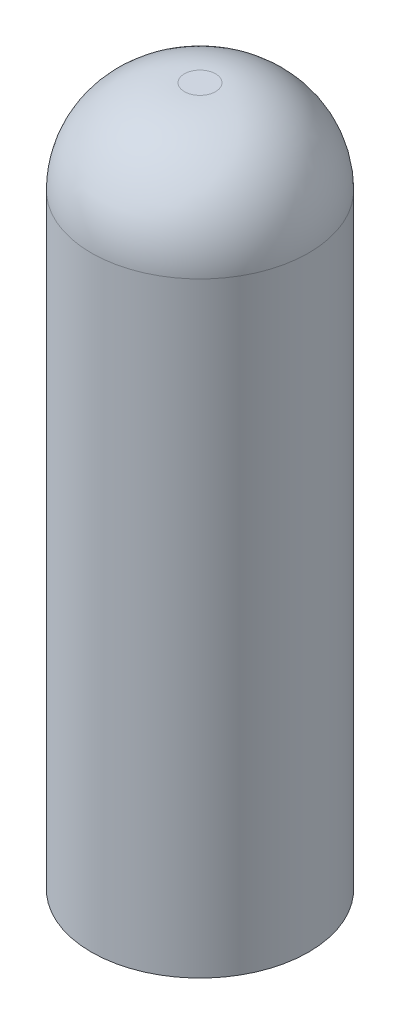
ISO-10303-21;
HEADER;
FILE_DESCRIPTION(('STEP AP214'),'2;1');
FILE_NAME('part.step','',(''),(''),'','','');
FILE_SCHEMA(('AUTOMOTIVE_DESIGN { 1 0 10303 214 1 1 1 1 }'));
ENDSEC;
DATA;
#1=APPLICATION_CONTEXT('core data for automotive mechanical design processes');
#2=APPLICATION_PROTOCOL_DEFINITION('international standard','automotive_design',2000,#1);
#3=PRODUCT_CONTEXT('',#1,'mechanical');
#4=PRODUCT('Part','Part','',(#3));
#5=PRODUCT_RELATED_PRODUCT_CATEGORY('part','',(#4));
#6=PRODUCT_DEFINITION_FORMATION('','',#4);
#7=PRODUCT_DEFINITION_CONTEXT('part definition',#1,'design');
#8=PRODUCT_DEFINITION('design','',#6,#7);
#9=PRODUCT_DEFINITION_SHAPE('','',#8);
#10=(LENGTH_UNIT() NAMED_UNIT(*) SI_UNIT(.MILLI.,.METRE.));
#11=(NAMED_UNIT(*) PLANE_ANGLE_UNIT() SI_UNIT($,.RADIAN.));
#12=(NAMED_UNIT(*) SI_UNIT($,.STERADIAN.) SOLID_ANGLE_UNIT());
#13=UNCERTAINTY_MEASURE_WITH_UNIT(LENGTH_MEASURE(1.E-05),#10,'distance_accuracy_value','');
#14=(GEOMETRIC_REPRESENTATION_CONTEXT(3) GLOBAL_UNCERTAINTY_ASSIGNED_CONTEXT((#13)) GLOBAL_UNIT_ASSIGNED_CONTEXT((#10,
#11,#12)) REPRESENTATION_CONTEXT('',''));
#15=CARTESIAN_POINT('',(0.,0.,0.));
#16=DIRECTION('',(0.,0.,1.));
#17=DIRECTION('',(1.,0.,0.));
#18=AXIS2_PLACEMENT_3D('',#15,#16,#17);
#19=CARTESIAN_POINT('',(0.,45.,0.));
#20=DIRECTION('',(0.,-1.,0.));
#21=DIRECTION('',(0.,0.,-1.));
#22=AXIS2_PLACEMENT_3D('',#19,#20,#21);
#23=CYLINDRICAL_SURFACE('',#22,7.);
#24=CARTESIAN_POINT('',(0.,39.,0.));
#25=DIRECTION('',(0.,1.,0.));
#26=DIRECTION('',(0.,0.,1.));
#27=AXIS2_PLACEMENT_3D('',#24,#25,#26);
#28=CIRCLE('',#27,7.);
#29=CARTESIAN_POINT('',(0.,39.,-7.));
#30=VERTEX_POINT('',#29);
#31=EDGE_CURVE('E10',#30,#30,#28,.F.);
#32=CARTESIAN_POINT('',(0.,0.,0.));
#33=DIRECTION('',(0.,1.,0.));
#34=DIRECTION('',(0.,0.,1.));
#35=AXIS2_PLACEMENT_3D('',#32,#33,#34);
#36=CIRCLE('',#35,7.);
#37=CARTESIAN_POINT('',(0.,0.,-7.));
#38=VERTEX_POINT('',#37);
#39=EDGE_CURVE('E42',#38,#38,#36,.T.);
#40=CARTESIAN_POINT('',(0.,39.,-7.));
#41=CARTESIAN_POINT('',(0.,38.59375,-7.));
#42=CARTESIAN_POINT('',(0.,38.1875,-7.));
#43=CARTESIAN_POINT('',(0.,37.375,-7.));
#44=CARTESIAN_POINT('',(0.,36.96875,-7.));
#45=CARTESIAN_POINT('',(0.,36.15625,-7.));
#46=CARTESIAN_POINT('',(0.,35.75,-7.));
#47=CARTESIAN_POINT('',(0.,34.9375,-7.));
#48=CARTESIAN_POINT('',(0.,34.53125,-7.));
#49=CARTESIAN_POINT('',(0.,33.71875,-7.));
#50=CARTESIAN_POINT('',(0.,33.3125,-7.));
#51=CARTESIAN_POINT('',(0.,32.5,-7.));
#52=CARTESIAN_POINT('',(0.,32.09375,-7.));
#53=CARTESIAN_POINT('',(0.,31.28125,-7.));
#54=CARTESIAN_POINT('',(0.,30.875,-7.));
#55=CARTESIAN_POINT('',(0.,30.0625,-7.));
#56=CARTESIAN_POINT('',(0.,29.65625,-7.));
#57=CARTESIAN_POINT('',(0.,28.84375,-7.));
#58=CARTESIAN_POINT('',(0.,28.4375,-7.));
#59=CARTESIAN_POINT('',(0.,27.625,-7.));
#60=CARTESIAN_POINT('',(0.,27.21875,-7.));
#61=CARTESIAN_POINT('',(0.,26.40625,-7.));
#62=CARTESIAN_POINT('',(0.,26.,-7.));
#63=CARTESIAN_POINT('',(0.,25.1875,-7.));
#64=CARTESIAN_POINT('',(0.,24.78125,-7.));
#65=CARTESIAN_POINT('',(0.,23.96875,-7.));
#66=CARTESIAN_POINT('',(0.,23.5625,-7.));
#67=CARTESIAN_POINT('',(0.,22.75,-7.));
#68=CARTESIAN_POINT('',(0.,22.34375,-7.));
#69=CARTESIAN_POINT('',(0.,21.53125,-7.));
#70=CARTESIAN_POINT('',(0.,21.125,-7.));
#71=CARTESIAN_POINT('',(0.,20.3125,-7.));
#72=CARTESIAN_POINT('',(0.,19.90625,-7.));
#73=CARTESIAN_POINT('',(0.,19.09375,-7.));
#74=CARTESIAN_POINT('',(0.,18.6875,-7.));
#75=CARTESIAN_POINT('',(0.,17.875,-7.));
#76=CARTESIAN_POINT('',(0.,17.46875,-7.));
#77=CARTESIAN_POINT('',(0.,16.65625,-7.));
#78=CARTESIAN_POINT('',(0.,16.25,-7.));
#79=CARTESIAN_POINT('',(0.,15.4375,-7.));
#80=CARTESIAN_POINT('',(0.,15.03125,-7.));
#81=CARTESIAN_POINT('',(0.,14.21875,-7.));
#82=CARTESIAN_POINT('',(0.,13.8125,-7.));
#83=CARTESIAN_POINT('',(0.,13.,-7.));
#84=CARTESIAN_POINT('',(0.,12.59375,-7.));
#85=CARTESIAN_POINT('',(0.,11.78125,-7.));
#86=CARTESIAN_POINT('',(0.,11.375,-7.));
#87=CARTESIAN_POINT('',(0.,10.5625,-7.));
#88=CARTESIAN_POINT('',(0.,10.15625,-7.));
#89=CARTESIAN_POINT('',(0.,9.34375,-7.));
#90=CARTESIAN_POINT('',(0.,8.9375,-7.));
#91=CARTESIAN_POINT('',(0.,8.12499999999999,-7.));
#92=CARTESIAN_POINT('',(0.,7.71874999999999,-7.));
#93=CARTESIAN_POINT('',(0.,6.90625,-7.));
#94=CARTESIAN_POINT('',(0.,6.5,-7.));
#95=CARTESIAN_POINT('',(0.,5.6875,-7.));
#96=CARTESIAN_POINT('',(0.,5.28125,-7.));
#97=CARTESIAN_POINT('',(0.,4.46875,-7.));
#98=CARTESIAN_POINT('',(0.,4.06249999999999,-7.));
#99=CARTESIAN_POINT('',(0.,3.25,-7.));
#100=CARTESIAN_POINT('',(0.,2.84375,-7.));
#101=CARTESIAN_POINT('',(0.,2.03125,-7.));
#102=CARTESIAN_POINT('',(0.,1.625,-7.));
#103=CARTESIAN_POINT('',(0.,0.812499999999996,-7.));
#104=CARTESIAN_POINT('',(0.,0.406249999999994,-7.));
#105=CARTESIAN_POINT('',(0.,0.,-7.));
#106=B_SPLINE_CURVE_WITH_KNOTS('',3,(#40,#41,#42,#43,#44,#45,#46,#47,#48,#49,#50,#51,#52,#53,
#54,#55,#56,#57,#58,#59,#60,#61,#62,#63,#64,#65,#66,#67,#68,#69,#70,#71,#72,#73,#74,#75,#76,#77,
#78,#79,#80,#81,#82,#83,#84,#85,#86,#87,#88,#89,#90,#91,#92,#93,#94,#95,#96,#97,#98,#99,#100,
#101,#102,#103,#104,#105),.UNSPECIFIED.,.F.,.F.,(4,2,2,2,2,2,2,2,2,2,2,2,2,2,2,2,2,2,2,2,2,2,2,
2,2,2,2,2,2,2,2,2,4),(0.,1.21875,2.4375,3.65625,4.875,6.09375,7.31250000000001,8.53125,9.75,
10.96875,12.1875,13.40625,14.625,15.84375,17.0625,18.28125,19.5,20.71875,21.9375,23.15625,
24.375,25.59375,26.8125,28.03125,29.25,30.46875,31.6875,32.90625,34.125,35.34375,36.5625,
37.78125,39.),.UNSPECIFIED.);
#107=EDGE_CURVE('BSEAM31',#30,#38,#106,.T.);
#108=ORIENTED_EDGE('',*,*,#31,.T.);
#109=ORIENTED_EDGE('',*,*,#39,.T.);
#110=ORIENTED_EDGE('',*,*,#107,.T.);
#111=ORIENTED_EDGE('',*,*,#107,.F.);
#112=EDGE_LOOP('',(#108,#110,#109,#111));
#113=FACE_BOUND('',#112,.T.);
#114=ADVANCED_FACE('F31',(#113),#23,.T.);
#115=CARTESIAN_POINT('',(0.,45.,0.));
#116=DIRECTION('',(0.,1.,0.));
#117=DIRECTION('',(0.,0.,1.));
#118=AXIS2_PLACEMENT_3D('',#115,#116,#117);
#119=PLANE('',#118);
#120=CARTESIAN_POINT('',(0.,45.,0.));
#121=DIRECTION('',(0.,1.,0.));
#122=DIRECTION('',(0.,0.,1.));
#123=AXIS2_PLACEMENT_3D('',#120,#121,#122);
#124=CIRCLE('',#123,1.);
#125=CARTESIAN_POINT('',(0.,45.,1.));
#126=VERTEX_POINT('',#125);
#127=EDGE_CURVE('E38',#126,#126,#124,.T.);
#128=ORIENTED_EDGE('',*,*,#127,.T.);
#129=EDGE_LOOP('',(#128));
#130=FACE_BOUND('',#129,.T.);
#131=ADVANCED_FACE('F66',(#130),#119,.T.);
#132=CARTESIAN_POINT('',(0.,0.,0.));
#133=DIRECTION('',(0.,1.,0.));
#134=DIRECTION('',(0.,0.,1.));
#135=AXIS2_PLACEMENT_3D('',#132,#133,#134);
#136=PLANE('',#135);
#137=CARTESIAN_POINT('',(0.,0.,0.));
#138=DIRECTION('',(0.,-1.,0.));
#139=DIRECTION('',(0.,0.,-1.));
#140=AXIS2_PLACEMENT_3D('',#137,#138,#139);
#141=CIRCLE('',#140,2.05);
#142=CARTESIAN_POINT('',(0.,0.,-2.05));
#143=VERTEX_POINT('',#142);
#144=EDGE_CURVE('E49',#143,#143,#141,.T.);
#145=ORIENTED_EDGE('',*,*,#144,.F.);
#146=EDGE_LOOP('',(#145));
#147=FACE_BOUND('',#146,.T.);
#148=ORIENTED_EDGE('',*,*,#39,.F.);
#149=EDGE_LOOP('',(#148));
#150=FACE_BOUND('',#149,.T.);
#151=ADVANCED_FACE('F63',(#147,#150),#136,.F.);
#152=CARTESIAN_POINT('',(0.,39.,0.));
#153=DIRECTION('',(0.,1.,0.));
#154=DIRECTION('',(0.,0.,1.));
#155=AXIS2_PLACEMENT_3D('',#152,#153,#154);
#156=DEGENERATE_TOROIDAL_SURFACE('',#155,1.,6.,.T.);
#157=ORIENTED_EDGE('',*,*,#31,.F.);
#158=EDGE_LOOP('',(#157));
#159=FACE_BOUND('',#158,.T.);
#160=ORIENTED_EDGE('',*,*,#127,.F.);
#161=EDGE_LOOP('',(#160));
#162=FACE_BOUND('',#161,.T.);
#163=ADVANCED_FACE('F33',(#159,#162),#156,.T.);
#164=CARTESIAN_POINT('',(0.,6.,0.));
#165=DIRECTION('',(0.,-1.,0.));
#166=DIRECTION('',(0.,0.,-1.));
#167=AXIS2_PLACEMENT_3D('',#164,#165,#166);
#168=CYLINDRICAL_SURFACE('',#167,2.05);
#169=CARTESIAN_POINT('',(0.,6.,0.));
#170=DIRECTION('',(0.,-1.,0.));
#171=DIRECTION('',(0.,0.,-1.));
#172=AXIS2_PLACEMENT_3D('',#169,#170,#171);
#173=CIRCLE('',#172,2.05);
#174=CARTESIAN_POINT('',(0.,6.,-2.05));
#175=VERTEX_POINT('',#174);
#176=EDGE_CURVE('E46',#175,#175,#173,.T.);
#177=ORIENTED_EDGE('',*,*,#176,.F.);
#178=EDGE_LOOP('',(#177));
#179=FACE_BOUND('',#178,.T.);
#180=ORIENTED_EDGE('',*,*,#144,.T.);
#181=EDGE_LOOP('',(#180));
#182=FACE_BOUND('',#181,.T.);
#183=ADVANCED_FACE('F57',(#179,#182),#168,.F.);
#184=CARTESIAN_POINT('',(0.,6.,0.));
#185=DIRECTION('',(0.,-1.,0.));
#186=DIRECTION('',(0.,0.,-1.));
#187=AXIS2_PLACEMENT_3D('',#184,#185,#186);
#188=PLANE('',#187);
#189=ORIENTED_EDGE('',*,*,#176,.T.);
#190=EDGE_LOOP('',(#189));
#191=FACE_BOUND('',#190,.T.);
#192=ADVANCED_FACE('F55',(#191),#188,.T.);
#193=CLOSED_SHELL('',(#114,#131,#151,#163,#183,#192));
#194=MANIFOLD_SOLID_BREP('B2',#193);
#195=ADVANCED_BREP_SHAPE_REPRESENTATION('',(#18,#194),#14);
#196=SHAPE_DEFINITION_REPRESENTATION(#9,#195);
ENDSEC;
END-ISO-10303-21;
